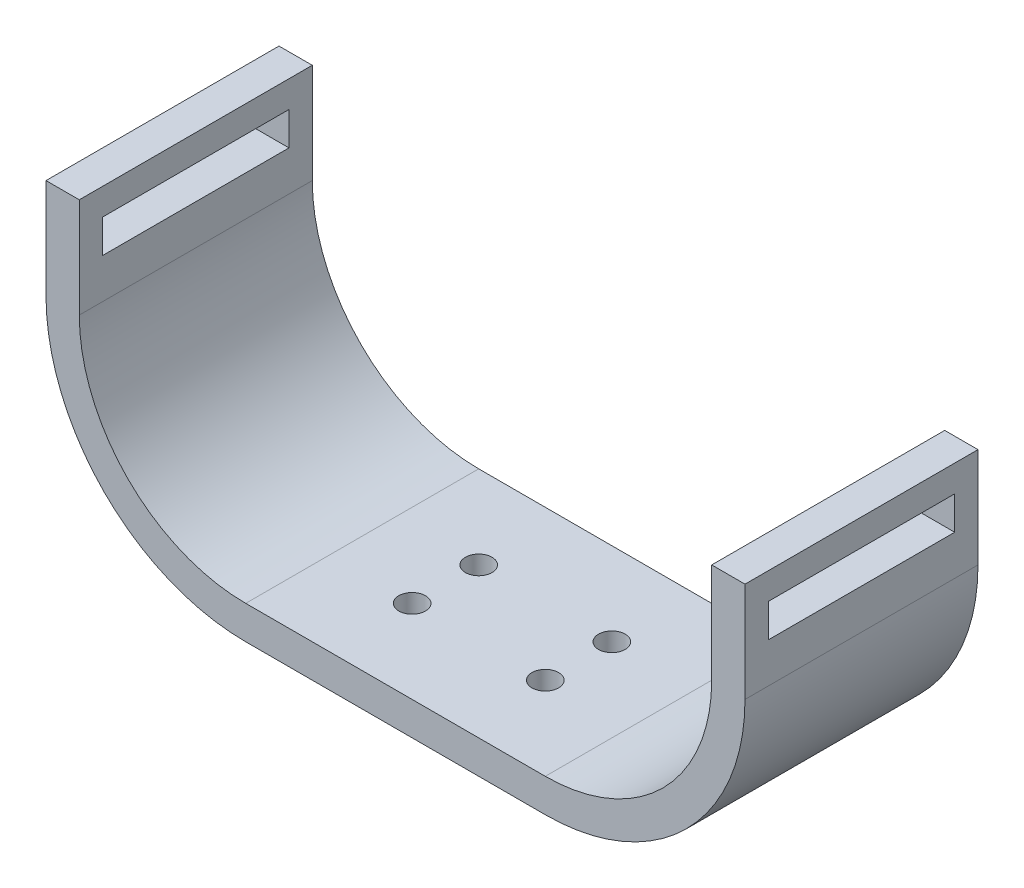
ISO-10303-21;
HEADER;
FILE_DESCRIPTION(('STEP AP214'),'2;1');
FILE_NAME('part.step','',(''),(''),'','','');
FILE_SCHEMA(('AUTOMOTIVE_DESIGN { 1 0 10303 214 1 1 1 1 }'));
ENDSEC;
DATA;
#1=APPLICATION_CONTEXT('core data for automotive mechanical design processes');
#2=APPLICATION_PROTOCOL_DEFINITION('international standard','automotive_design',2000,#1);
#3=PRODUCT_CONTEXT('',#1,'mechanical');
#4=PRODUCT('Part','Part','',(#3));
#5=PRODUCT_RELATED_PRODUCT_CATEGORY('part','',(#4));
#6=PRODUCT_DEFINITION_FORMATION('','',#4);
#7=PRODUCT_DEFINITION_CONTEXT('part definition',#1,'design');
#8=PRODUCT_DEFINITION('design','',#6,#7);
#9=PRODUCT_DEFINITION_SHAPE('','',#8);
#10=(LENGTH_UNIT() NAMED_UNIT(*) SI_UNIT(.MILLI.,.METRE.));
#11=(NAMED_UNIT(*) PLANE_ANGLE_UNIT() SI_UNIT($,.RADIAN.));
#12=(NAMED_UNIT(*) SI_UNIT($,.STERADIAN.) SOLID_ANGLE_UNIT());
#13=UNCERTAINTY_MEASURE_WITH_UNIT(LENGTH_MEASURE(1.E-05),#10,'distance_accuracy_value','');
#14=(GEOMETRIC_REPRESENTATION_CONTEXT(3) GLOBAL_UNCERTAINTY_ASSIGNED_CONTEXT((#13)) GLOBAL_UNIT_ASSIGNED_CONTEXT((#10,
#11,#12)) REPRESENTATION_CONTEXT('',''));
#15=CARTESIAN_POINT('',(0.,0.,0.));
#16=DIRECTION('',(0.,0.,1.));
#17=DIRECTION('',(1.,0.,0.));
#18=AXIS2_PLACEMENT_3D('',#15,#16,#17);
#19=CARTESIAN_POINT('',(22.5000000000001,27.500001563175,35.));
#20=DIRECTION('',(0.,0.,-1.));
#21=DIRECTION('',(-1.,0.,0.));
#22=AXIS2_PLACEMENT_3D('',#19,#20,#21);
#23=CYLINDRICAL_SURFACE('',#22,25.0000034389849);
#24=CARTESIAN_POINT('',(22.5000000000001,27.500001563175,0.));
#25=DIRECTION('',(0.,0.,-1.));
#26=DIRECTION('',(1.,0.,0.));
#27=AXIS2_PLACEMENT_3D('',#24,#25,#26);
#28=CIRCLE('',#27,25.0000034389849);
#29=CARTESIAN_POINT('',(47.5000037516199,27.500001563175,0.));
#30=VERTEX_POINT('',#29);
#31=CARTESIAN_POINT('',(22.5,2.49999843682498,0.));
#32=VERTEX_POINT('',#31);
#33=EDGE_CURVE('E226',#30,#32,#28,.T.);
#34=ORIENTED_EDGE('',*,*,#33,.T.);
#35=DIRECTION('',(0.,0.,-1.));
#36=VECTOR('',#35,1.);
#37=CARTESIAN_POINT('',(22.5,2.49999843682498,35.));
#38=LINE('',#37,#36);
#39=CARTESIAN_POINT('',(22.5,2.49999843682498,35.));
#40=VERTEX_POINT('',#39);
#41=EDGE_CURVE('E309',#40,#32,#38,.T.);
#42=ORIENTED_EDGE('',*,*,#41,.F.);
#43=CARTESIAN_POINT('',(22.5000000000001,27.500001563175,35.));
#44=DIRECTION('',(0.,0.,-1.));
#45=DIRECTION('',(1.,0.,0.));
#46=AXIS2_PLACEMENT_3D('',#43,#44,#45);
#47=CIRCLE('',#46,25.0000034389849);
#48=CARTESIAN_POINT('',(47.5000037516199,27.500001563175,35.));
#49=VERTEX_POINT('',#48);
#50=EDGE_CURVE('E227',#49,#40,#47,.T.);
#51=ORIENTED_EDGE('',*,*,#50,.F.);
#52=DIRECTION('',(0.,0.,-1.));
#53=VECTOR('',#52,1.);
#54=CARTESIAN_POINT('',(47.5000037516199,27.500001563175,35.));
#55=LINE('',#54,#53);
#56=EDGE_CURVE('E253',#49,#30,#55,.T.);
#57=ORIENTED_EDGE('',*,*,#56,.T.);
#58=EDGE_LOOP('',(#34,#42,#51,#57));
#59=FACE_BOUND('',#58,.T.);
#60=ADVANCED_FACE('F33',(#59),#23,.F.);
#61=CARTESIAN_POINT('',(-22.5,2.49999843682497,35.));
#62=DIRECTION('',(0.,-1.,0.));
#63=DIRECTION('',(1.,0.,0.));
#64=AXIS2_PLACEMENT_3D('',#61,#62,#63);
#65=PLANE('',#64);
#66=CARTESIAN_POINT('',(10.,2.49999843682498,12.5));
#67=DIRECTION('',(0.,1.,0.));
#68=DIRECTION('',(1.,0.,0.));
#69=AXIS2_PLACEMENT_3D('',#66,#67,#68);
#70=CIRCLE('',#69,2.);
#71=CARTESIAN_POINT('',(12.,2.49999843682498,12.5));
#72=VERTEX_POINT('',#71);
#73=EDGE_CURVE('E618',#72,#72,#70,.T.);
#74=ORIENTED_EDGE('',*,*,#73,.F.);
#75=EDGE_LOOP('',(#74));
#76=FACE_BOUND('',#75,.T.);
#77=CARTESIAN_POINT('',(10.,2.49999843682498,22.5));
#78=DIRECTION('',(0.,1.,0.));
#79=DIRECTION('',(1.,0.,0.));
#80=AXIS2_PLACEMENT_3D('',#77,#78,#79);
#81=CIRCLE('',#80,2.);
#82=CARTESIAN_POINT('',(12.,2.49999843682498,22.5));
#83=VERTEX_POINT('',#82);
#84=EDGE_CURVE('E620',#83,#83,#81,.T.);
#85=ORIENTED_EDGE('',*,*,#84,.F.);
#86=EDGE_LOOP('',(#85));
#87=FACE_BOUND('',#86,.T.);
#88=CARTESIAN_POINT('',(-10.,2.49999843682498,22.5));
#89=DIRECTION('',(0.,1.,0.));
#90=DIRECTION('',(-1.,0.,0.));
#91=AXIS2_PLACEMENT_3D('',#88,#89,#90);
#92=CIRCLE('',#91,2.);
#93=CARTESIAN_POINT('',(-12.,2.49999843682498,22.5));
#94=VERTEX_POINT('',#93);
#95=EDGE_CURVE('E631',#94,#94,#92,.T.);
#96=ORIENTED_EDGE('',*,*,#95,.F.);
#97=EDGE_LOOP('',(#96));
#98=FACE_BOUND('',#97,.T.);
#99=CARTESIAN_POINT('',(-10.,2.49999843682498,12.5));
#100=DIRECTION('',(0.,1.,0.));
#101=DIRECTION('',(-1.,0.,0.));
#102=AXIS2_PLACEMENT_3D('',#99,#100,#101);
#103=CIRCLE('',#102,2.);
#104=CARTESIAN_POINT('',(-12.,2.49999843682498,12.5));
#105=VERTEX_POINT('',#104);
#106=EDGE_CURVE('E196',#105,#105,#103,.T.);
#107=ORIENTED_EDGE('',*,*,#106,.F.);
#108=EDGE_LOOP('',(#107));
#109=FACE_BOUND('',#108,.T.);
#110=DIRECTION('',(-1.,0.,0.));
#111=VECTOR('',#110,1.);
#112=CARTESIAN_POINT('',(-22.5,2.49999843682497,0.));
#113=LINE('',#112,#111);
#114=CARTESIAN_POINT('',(-22.5,2.49999843682497,0.));
#115=VERTEX_POINT('',#114);
#116=EDGE_CURVE('E256',#32,#115,#113,.T.);
#117=ORIENTED_EDGE('',*,*,#116,.T.);
#118=DIRECTION('',(0.,0.,-1.));
#119=VECTOR('',#118,1.);
#120=CARTESIAN_POINT('',(-22.5,2.49999843682497,35.));
#121=LINE('',#120,#119);
#122=CARTESIAN_POINT('',(-22.5,2.49999843682497,35.));
#123=VERTEX_POINT('',#122);
#124=EDGE_CURVE('E306',#123,#115,#121,.T.);
#125=ORIENTED_EDGE('',*,*,#124,.F.);
#126=DIRECTION('',(-1.,0.,0.));
#127=VECTOR('',#126,1.);
#128=CARTESIAN_POINT('',(-22.5,2.49999843682497,35.));
#129=LINE('',#128,#127);
#130=EDGE_CURVE('E230',#40,#123,#129,.T.);
#131=ORIENTED_EDGE('',*,*,#130,.F.);
#132=ORIENTED_EDGE('',*,*,#41,.T.);
#133=EDGE_LOOP('',(#117,#125,#131,#132));
#134=FACE_BOUND('',#133,.T.);
#135=ADVANCED_FACE('F357',(#76,#87,#98,#109,#134),#65,.F.);
#136=CARTESIAN_POINT('',(-22.5000000000001,27.500001563175,35.));
#137=DIRECTION('',(0.,0.,-1.));
#138=DIRECTION('',(-1.,0.,0.));
#139=AXIS2_PLACEMENT_3D('',#136,#137,#138);
#140=CYLINDRICAL_SURFACE('',#139,25.0000034389849);
#141=CARTESIAN_POINT('',(-22.5000000000001,27.500001563175,0.));
#142=DIRECTION('',(0.,0.,-1.));
#143=DIRECTION('',(-1.,0.,0.));
#144=AXIS2_PLACEMENT_3D('',#141,#142,#143);
#145=CIRCLE('',#144,25.0000034389849);
#146=CARTESIAN_POINT('',(-47.500003438985,27.500001563175,0.));
#147=VERTEX_POINT('',#146);
#148=EDGE_CURVE('E258',#115,#147,#145,.T.);
#149=ORIENTED_EDGE('',*,*,#148,.T.);
#150=DIRECTION('',(0.,0.,-1.));
#151=VECTOR('',#150,1.);
#152=CARTESIAN_POINT('',(-47.500003438985,27.500001563175,35.));
#153=LINE('',#152,#151);
#154=CARTESIAN_POINT('',(-47.500003438985,27.500001563175,35.));
#155=VERTEX_POINT('',#154);
#156=EDGE_CURVE('E303',#155,#147,#153,.T.);
#157=ORIENTED_EDGE('',*,*,#156,.F.);
#158=CARTESIAN_POINT('',(-22.5000000000001,27.500001563175,35.));
#159=DIRECTION('',(0.,0.,-1.));
#160=DIRECTION('',(-1.,0.,0.));
#161=AXIS2_PLACEMENT_3D('',#158,#159,#160);
#162=CIRCLE('',#161,25.0000034389849);
#163=EDGE_CURVE('E233',#123,#155,#162,.T.);
#164=ORIENTED_EDGE('',*,*,#163,.F.);
#165=ORIENTED_EDGE('',*,*,#124,.T.);
#166=EDGE_LOOP('',(#149,#157,#164,#165));
#167=FACE_BOUND('',#166,.T.);
#168=ADVANCED_FACE('F362',(#167),#140,.F.);
#169=CARTESIAN_POINT('',(-47.5000037516199,42.500001563175,35.));
#170=DIRECTION('',(-1.,0.,0.));
#171=DIRECTION('',(0.,-1.,0.));
#172=AXIS2_PLACEMENT_3D('',#169,#170,#171);
#173=PLANE('',#172);
#174=DIRECTION('',(0.,0.,-1.));
#175=VECTOR('',#174,1.);
#176=CARTESIAN_POINT('',(-47.5000037516199,38.500001563175,35.));
#177=LINE('',#176,#175);
#178=CARTESIAN_POINT('',(-47.5000037516199,38.500001563175,31.5));
#179=VERTEX_POINT('',#178);
#180=CARTESIAN_POINT('',(-47.5000037516199,38.500001563175,3.5));
#181=VERTEX_POINT('',#180);
#182=EDGE_CURVE('E211',#179,#181,#177,.T.);
#183=ORIENTED_EDGE('',*,*,#182,.T.);
#184=DIRECTION('',(0.,-1.,0.));
#185=VECTOR('',#184,1.);
#186=CARTESIAN_POINT('',(-47.5000037516199,42.500001563175,3.5));
#187=LINE('',#186,#185);
#188=CARTESIAN_POINT('',(-47.5000037516199,33.500001563175,3.5));
#189=VERTEX_POINT('',#188);
#190=EDGE_CURVE('E175',#181,#189,#187,.T.);
#191=ORIENTED_EDGE('',*,*,#190,.T.);
#192=DIRECTION('',(0.,0.,1.));
#193=VECTOR('',#192,1.);
#194=CARTESIAN_POINT('',(-47.5000037516199,33.500001563175,35.));
#195=LINE('',#194,#193);
#196=CARTESIAN_POINT('',(-47.5000037516199,33.500001563175,31.5));
#197=VERTEX_POINT('',#196);
#198=EDGE_CURVE('E222',#189,#197,#195,.T.);
#199=ORIENTED_EDGE('',*,*,#198,.T.);
#200=DIRECTION('',(0.,1.,0.));
#201=VECTOR('',#200,1.);
#202=CARTESIAN_POINT('',(-47.5000037516199,42.500001563175,31.5));
#203=LINE('',#202,#201);
#204=EDGE_CURVE('E219',#197,#179,#203,.T.);
#205=ORIENTED_EDGE('',*,*,#204,.T.);
#206=EDGE_LOOP('',(#183,#191,#199,#205));
#207=FACE_BOUND('',#206,.T.);
#208=DIRECTION('',(0.,1.,0.));
#209=VECTOR('',#208,1.);
#210=CARTESIAN_POINT('',(-47.5000037516199,42.500001563175,0.));
#211=LINE('',#210,#209);
#212=CARTESIAN_POINT('',(-47.5000037516199,42.500001563175,0.));
#213=VERTEX_POINT('',#212);
#214=EDGE_CURVE('E260',#147,#213,#211,.T.);
#215=ORIENTED_EDGE('',*,*,#214,.T.);
#216=DIRECTION('',(0.,0.,-1.));
#217=VECTOR('',#216,1.);
#218=CARTESIAN_POINT('',(-47.5000037516199,42.500001563175,35.));
#219=LINE('',#218,#217);
#220=CARTESIAN_POINT('',(-47.5000037516199,42.500001563175,35.));
#221=VERTEX_POINT('',#220);
#222=EDGE_CURVE('E300',#221,#213,#219,.T.);
#223=ORIENTED_EDGE('',*,*,#222,.F.);
#224=DIRECTION('',(0.,1.,0.));
#225=VECTOR('',#224,1.);
#226=CARTESIAN_POINT('',(-47.5000037516199,42.500001563175,35.));
#227=LINE('',#226,#225);
#228=EDGE_CURVE('E235',#155,#221,#227,.T.);
#229=ORIENTED_EDGE('',*,*,#228,.F.);
#230=ORIENTED_EDGE('',*,*,#156,.T.);
#231=EDGE_LOOP('',(#215,#223,#229,#230));
#232=FACE_BOUND('',#231,.T.);
#233=ADVANCED_FACE('F409',(#207,#232),#173,.F.);
#234=CARTESIAN_POINT('',(-52.5000037516199,42.500001563175,35.));
#235=DIRECTION('',(0.,-1.,0.));
#236=DIRECTION('',(0.,0.,-1.));
#237=AXIS2_PLACEMENT_3D('',#234,#235,#236);
#238=PLANE('',#237);
#239=DIRECTION('',(-1.,0.,0.));
#240=VECTOR('',#239,1.);
#241=CARTESIAN_POINT('',(-52.5000037516199,42.500001563175,0.));
#242=LINE('',#241,#240);
#243=CARTESIAN_POINT('',(-52.5000037516199,42.500001563175,0.));
#244=VERTEX_POINT('',#243);
#245=EDGE_CURVE('E262',#213,#244,#242,.T.);
#246=ORIENTED_EDGE('',*,*,#245,.T.);
#247=DIRECTION('',(0.,0.,-1.));
#248=VECTOR('',#247,1.);
#249=CARTESIAN_POINT('',(-52.5000037516199,42.500001563175,35.));
#250=LINE('',#249,#248);
#251=CARTESIAN_POINT('',(-52.5000037516199,42.500001563175,35.));
#252=VERTEX_POINT('',#251);
#253=EDGE_CURVE('E297',#252,#244,#250,.T.);
#254=ORIENTED_EDGE('',*,*,#253,.F.);
#255=DIRECTION('',(-1.,0.,0.));
#256=VECTOR('',#255,1.);
#257=CARTESIAN_POINT('',(-52.5000037516199,42.500001563175,35.));
#258=LINE('',#257,#256);
#259=EDGE_CURVE('E237',#221,#252,#258,.T.);
#260=ORIENTED_EDGE('',*,*,#259,.F.);
#261=ORIENTED_EDGE('',*,*,#222,.T.);
#262=EDGE_LOOP('',(#246,#254,#260,#261));
#263=FACE_BOUND('',#262,.T.);
#264=ADVANCED_FACE('F406',(#263),#238,.F.);
#265=CARTESIAN_POINT('',(-52.5000037516199,27.500001563175,35.));
#266=DIRECTION('',(1.,0.,0.));
#267=DIRECTION('',(0.,0.,-1.));
#268=AXIS2_PLACEMENT_3D('',#265,#266,#267);
#269=PLANE('',#268);
#270=DIRECTION('',(0.,0.,-1.));
#271=VECTOR('',#270,1.);
#272=CARTESIAN_POINT('',(-52.5000037516198,33.500001563175,31.5));
#273=LINE('',#272,#271);
#274=CARTESIAN_POINT('',(-52.5000037516198,33.500001563175,31.5));
#275=VERTEX_POINT('',#274);
#276=CARTESIAN_POINT('',(-52.5000037516198,33.500001563175,3.5));
#277=VERTEX_POINT('',#276);
#278=EDGE_CURVE('E189',#275,#277,#273,.T.);
#279=ORIENTED_EDGE('',*,*,#278,.T.);
#280=DIRECTION('',(0.,1.,0.));
#281=VECTOR('',#280,1.);
#282=CARTESIAN_POINT('',(-52.5000037516198,33.500001563175,3.5));
#283=LINE('',#282,#281);
#284=CARTESIAN_POINT('',(-52.5000037516199,38.500001563175,3.5));
#285=VERTEX_POINT('',#284);
#286=EDGE_CURVE('E172',#277,#285,#283,.T.);
#287=ORIENTED_EDGE('',*,*,#286,.T.);
#288=DIRECTION('',(0.,0.,1.));
#289=VECTOR('',#288,1.);
#290=CARTESIAN_POINT('',(-52.5000037516199,38.500001563175,31.5));
#291=LINE('',#290,#289);
#292=CARTESIAN_POINT('',(-52.5000037516199,38.500001563175,31.5));
#293=VERTEX_POINT('',#292);
#294=EDGE_CURVE('E181',#285,#293,#291,.T.);
#295=ORIENTED_EDGE('',*,*,#294,.T.);
#296=DIRECTION('',(0.,-1.,0.));
#297=VECTOR('',#296,1.);
#298=CARTESIAN_POINT('',(-52.5000037516198,33.500001563175,31.5));
#299=LINE('',#298,#297);
#300=EDGE_CURVE('E55',#293,#275,#299,.T.);
#301=ORIENTED_EDGE('',*,*,#300,.T.);
#302=EDGE_LOOP('',(#279,#287,#295,#301));
#303=FACE_BOUND('',#302,.T.);
#304=DIRECTION('',(0.,-1.,0.));
#305=VECTOR('',#304,1.);
#306=CARTESIAN_POINT('',(-52.5000037516199,27.500001563175,0.));
#307=LINE('',#306,#305);
#308=CARTESIAN_POINT('',(-52.5000037516199,27.500001563175,0.));
#309=VERTEX_POINT('',#308);
#310=EDGE_CURVE('E264',#244,#309,#307,.T.);
#311=ORIENTED_EDGE('',*,*,#310,.T.);
#312=DIRECTION('',(0.,0.,-1.));
#313=VECTOR('',#312,1.);
#314=CARTESIAN_POINT('',(-52.5000037516199,27.500001563175,35.));
#315=LINE('',#314,#313);
#316=CARTESIAN_POINT('',(-52.5000037516199,27.500001563175,35.));
#317=VERTEX_POINT('',#316);
#318=EDGE_CURVE('E294',#317,#309,#315,.T.);
#319=ORIENTED_EDGE('',*,*,#318,.F.);
#320=DIRECTION('',(0.,-1.,0.));
#321=VECTOR('',#320,1.);
#322=CARTESIAN_POINT('',(-52.5000037516199,27.500001563175,35.));
#323=LINE('',#322,#321);
#324=EDGE_CURVE('E239',#252,#317,#323,.T.);
#325=ORIENTED_EDGE('',*,*,#324,.F.);
#326=ORIENTED_EDGE('',*,*,#253,.T.);
#327=EDGE_LOOP('',(#311,#319,#325,#326));
#328=FACE_BOUND('',#327,.T.);
#329=ADVANCED_FACE('F186',(#303,#328),#269,.F.);
#330=CARTESIAN_POINT('',(-22.5000000000001,27.500001563175,35.));
#331=DIRECTION('',(0.,0.,-1.));
#332=DIRECTION('',(-1.,0.,0.));
#333=AXIS2_PLACEMENT_3D('',#330,#331,#332);
#334=CYLINDRICAL_SURFACE('',#333,30.0000018758099);
#335=CARTESIAN_POINT('',(-22.5000000000001,27.500001563175,0.));
#336=DIRECTION('',(0.,0.,1.));
#337=DIRECTION('',(-1.,0.,0.));
#338=AXIS2_PLACEMENT_3D('',#335,#336,#337);
#339=CIRCLE('',#338,30.0000018758099);
#340=CARTESIAN_POINT('',(-22.5,-2.50000031263487,0.));
#341=VERTEX_POINT('',#340);
#342=EDGE_CURVE('E266',#309,#341,#339,.T.);
#343=ORIENTED_EDGE('',*,*,#342,.T.);
#344=DIRECTION('',(0.,0.,-1.));
#345=VECTOR('',#344,1.);
#346=CARTESIAN_POINT('',(-22.5,-2.50000031263487,35.));
#347=LINE('',#346,#345);
#348=CARTESIAN_POINT('',(-22.5,-2.50000031263487,35.));
#349=VERTEX_POINT('',#348);
#350=EDGE_CURVE('E291',#349,#341,#347,.T.);
#351=ORIENTED_EDGE('',*,*,#350,.F.);
#352=CARTESIAN_POINT('',(-22.5000000000001,27.500001563175,35.));
#353=DIRECTION('',(0.,0.,1.));
#354=DIRECTION('',(-1.,0.,0.));
#355=AXIS2_PLACEMENT_3D('',#352,#353,#354);
#356=CIRCLE('',#355,30.0000018758099);
#357=EDGE_CURVE('E241',#317,#349,#356,.T.);
#358=ORIENTED_EDGE('',*,*,#357,.F.);
#359=ORIENTED_EDGE('',*,*,#318,.T.);
#360=EDGE_LOOP('',(#343,#351,#358,#359));
#361=FACE_BOUND('',#360,.T.);
#362=ADVANCED_FACE('F399',(#361),#334,.T.);
#363=CARTESIAN_POINT('',(-22.5,-2.49999843682498,35.));
#364=DIRECTION('',(0.,1.,0.));
#365=DIRECTION('',(-1.,0.,0.));
#366=AXIS2_PLACEMENT_3D('',#363,#364,#365);
#367=PLANE('',#366);
#368=CARTESIAN_POINT('',(10.,-2.50000031263488,12.5));
#369=DIRECTION('',(0.,1.,0.));
#370=DIRECTION('',(1.,0.,0.));
#371=AXIS2_PLACEMENT_3D('',#368,#369,#370);
#372=CIRCLE('',#371,2.);
#373=CARTESIAN_POINT('',(12.,-2.50000031263488,12.5));
#374=VERTEX_POINT('',#373);
#375=EDGE_CURVE('E615',#374,#374,#372,.T.);
#376=ORIENTED_EDGE('',*,*,#375,.T.);
#377=EDGE_LOOP('',(#376));
#378=FACE_BOUND('',#377,.T.);
#379=CARTESIAN_POINT('',(10.,-2.50000031263488,22.5));
#380=DIRECTION('',(0.,1.,0.));
#381=DIRECTION('',(1.,0.,0.));
#382=AXIS2_PLACEMENT_3D('',#379,#380,#381);
#383=CIRCLE('',#382,2.);
#384=CARTESIAN_POINT('',(12.,-2.50000031263488,22.5));
#385=VERTEX_POINT('',#384);
#386=EDGE_CURVE('E636',#385,#385,#383,.T.);
#387=ORIENTED_EDGE('',*,*,#386,.T.);
#388=EDGE_LOOP('',(#387));
#389=FACE_BOUND('',#388,.T.);
#390=CARTESIAN_POINT('',(-10.,-2.50000031263488,22.5));
#391=DIRECTION('',(0.,1.,0.));
#392=DIRECTION('',(-1.,0.,0.));
#393=AXIS2_PLACEMENT_3D('',#390,#391,#392);
#394=CIRCLE('',#393,2.);
#395=CARTESIAN_POINT('',(-12.,-2.50000031263488,22.5));
#396=VERTEX_POINT('',#395);
#397=EDGE_CURVE('E627',#396,#396,#394,.T.);
#398=ORIENTED_EDGE('',*,*,#397,.T.);
#399=EDGE_LOOP('',(#398));
#400=FACE_BOUND('',#399,.T.);
#401=CARTESIAN_POINT('',(-10.,-2.50000031263488,12.5));
#402=DIRECTION('',(0.,1.,0.));
#403=DIRECTION('',(-1.,0.,0.));
#404=AXIS2_PLACEMENT_3D('',#401,#402,#403);
#405=CIRCLE('',#404,2.);
#406=CARTESIAN_POINT('',(-12.,-2.50000031263488,12.5));
#407=VERTEX_POINT('',#406);
#408=EDGE_CURVE('E204',#407,#407,#405,.T.);
#409=ORIENTED_EDGE('',*,*,#408,.T.);
#410=EDGE_LOOP('',(#409));
#411=FACE_BOUND('',#410,.T.);
#412=DIRECTION('',(1.,0.,0.));
#413=VECTOR('',#412,1.);
#414=CARTESIAN_POINT('',(-22.5,-2.49999843682498,0.));
#415=LINE('',#414,#413);
#416=CARTESIAN_POINT('',(22.5,-2.49999843682498,0.));
#417=VERTEX_POINT('',#416);
#418=EDGE_CURVE('E268',#341,#417,#415,.T.);
#419=ORIENTED_EDGE('',*,*,#418,.T.);
#420=DIRECTION('',(0.,0.,-1.));
#421=VECTOR('',#420,1.);
#422=CARTESIAN_POINT('',(22.5,-2.49999843682498,35.));
#423=LINE('',#422,#421);
#424=CARTESIAN_POINT('',(22.5,-2.49999843682498,35.));
#425=VERTEX_POINT('',#424);
#426=EDGE_CURVE('E288',#425,#417,#423,.T.);
#427=ORIENTED_EDGE('',*,*,#426,.F.);
#428=DIRECTION('',(1.,0.,0.));
#429=VECTOR('',#428,1.);
#430=CARTESIAN_POINT('',(-22.5,-2.49999843682498,35.));
#431=LINE('',#430,#429);
#432=EDGE_CURVE('E243',#349,#425,#431,.T.);
#433=ORIENTED_EDGE('',*,*,#432,.F.);
#434=ORIENTED_EDGE('',*,*,#350,.T.);
#435=EDGE_LOOP('',(#419,#427,#433,#434));
#436=FACE_BOUND('',#435,.T.);
#437=ADVANCED_FACE('F393',(#378,#389,#400,#411,#436),#367,.F.);
#438=CARTESIAN_POINT('',(22.5000000000001,27.500001563175,35.));
#439=DIRECTION('',(0.,0.,-1.));
#440=DIRECTION('',(-1.,0.,0.));
#441=AXIS2_PLACEMENT_3D('',#438,#439,#440);
#442=CYLINDRICAL_SURFACE('',#441,30.0000018758099);
#443=CARTESIAN_POINT('',(22.5000000000001,27.500001563175,0.));
#444=DIRECTION('',(0.,0.,1.));
#445=DIRECTION('',(1.,0.,0.));
#446=AXIS2_PLACEMENT_3D('',#443,#444,#445);
#447=CIRCLE('',#446,30.0000018758099);
#448=CARTESIAN_POINT('',(52.50000187581,27.500001563175,0.));
#449=VERTEX_POINT('',#448);
#450=EDGE_CURVE('E270',#417,#449,#447,.T.);
#451=ORIENTED_EDGE('',*,*,#450,.T.);
#452=DIRECTION('',(0.,0.,-1.));
#453=VECTOR('',#452,1.);
#454=CARTESIAN_POINT('',(52.50000187581,27.500001563175,35.));
#455=LINE('',#454,#453);
#456=CARTESIAN_POINT('',(52.50000187581,27.500001563175,35.));
#457=VERTEX_POINT('',#456);
#458=EDGE_CURVE('E285',#457,#449,#455,.T.);
#459=ORIENTED_EDGE('',*,*,#458,.F.);
#460=CARTESIAN_POINT('',(22.5000000000001,27.500001563175,35.));
#461=DIRECTION('',(0.,0.,1.));
#462=DIRECTION('',(1.,0.,0.));
#463=AXIS2_PLACEMENT_3D('',#460,#461,#462);
#464=CIRCLE('',#463,30.0000018758099);
#465=EDGE_CURVE('E245',#425,#457,#464,.T.);
#466=ORIENTED_EDGE('',*,*,#465,.F.);
#467=ORIENTED_EDGE('',*,*,#426,.T.);
#468=EDGE_LOOP('',(#451,#459,#466,#467));
#469=FACE_BOUND('',#468,.T.);
#470=ADVANCED_FACE('F389',(#469),#442,.T.);
#471=CARTESIAN_POINT('',(52.5000037516199,27.500001563175,35.));
#472=DIRECTION('',(-1.,0.,0.));
#473=DIRECTION('',(0.,-1.,0.));
#474=AXIS2_PLACEMENT_3D('',#471,#472,#473);
#475=PLANE('',#474);
#476=DIRECTION('',(0.,0.,1.));
#477=VECTOR('',#476,1.);
#478=CARTESIAN_POINT('',(52.5000037516198,38.500001563175,31.5));
#479=LINE('',#478,#477);
#480=CARTESIAN_POINT('',(52.5000037516198,38.500001563175,3.5));
#481=VERTEX_POINT('',#480);
#482=CARTESIAN_POINT('',(52.5000037516198,38.500001563175,31.5));
#483=VERTEX_POINT('',#482);
#484=EDGE_CURVE('E203',#481,#483,#479,.T.);
#485=ORIENTED_EDGE('',*,*,#484,.F.);
#486=DIRECTION('',(0.,1.,0.));
#487=VECTOR('',#486,1.);
#488=CARTESIAN_POINT('',(52.5000037516198,33.500001563175,3.5));
#489=LINE('',#488,#487);
#490=CARTESIAN_POINT('',(52.5000037516198,33.500001563175,3.5));
#491=VERTEX_POINT('',#490);
#492=EDGE_CURVE('E201',#491,#481,#489,.T.);
#493=ORIENTED_EDGE('',*,*,#492,.F.);
#494=DIRECTION('',(0.,0.,-1.));
#495=VECTOR('',#494,1.);
#496=CARTESIAN_POINT('',(52.5000037516198,33.500001563175,31.5));
#497=LINE('',#496,#495);
#498=CARTESIAN_POINT('',(52.5000037516198,33.500001563175,31.5));
#499=VERTEX_POINT('',#498);
#500=EDGE_CURVE('E190',#499,#491,#497,.T.);
#501=ORIENTED_EDGE('',*,*,#500,.F.);
#502=DIRECTION('',(0.,-1.,0.));
#503=VECTOR('',#502,1.);
#504=CARTESIAN_POINT('',(52.5000037516198,33.500001563175,31.5));
#505=LINE('',#504,#503);
#506=EDGE_CURVE('E193',#483,#499,#505,.T.);
#507=ORIENTED_EDGE('',*,*,#506,.F.);
#508=EDGE_LOOP('',(#485,#493,#501,#507));
#509=FACE_BOUND('',#508,.T.);
#510=DIRECTION('',(0.,1.,0.));
#511=VECTOR('',#510,1.);
#512=CARTESIAN_POINT('',(52.5000037516199,27.500001563175,0.));
#513=LINE('',#512,#511);
#514=CARTESIAN_POINT('',(52.5000037516198,42.500001563175,0.));
#515=VERTEX_POINT('',#514);
#516=EDGE_CURVE('E272',#449,#515,#513,.T.);
#517=ORIENTED_EDGE('',*,*,#516,.T.);
#518=DIRECTION('',(0.,0.,-1.));
#519=VECTOR('',#518,1.);
#520=CARTESIAN_POINT('',(52.5000037516198,42.500001563175,35.));
#521=LINE('',#520,#519);
#522=CARTESIAN_POINT('',(52.5000037516198,42.500001563175,35.));
#523=VERTEX_POINT('',#522);
#524=EDGE_CURVE('E282',#523,#515,#521,.T.);
#525=ORIENTED_EDGE('',*,*,#524,.F.);
#526=DIRECTION('',(0.,1.,0.));
#527=VECTOR('',#526,1.);
#528=CARTESIAN_POINT('',(52.5000037516199,27.500001563175,35.));
#529=LINE('',#528,#527);
#530=EDGE_CURVE('E247',#457,#523,#529,.T.);
#531=ORIENTED_EDGE('',*,*,#530,.F.);
#532=ORIENTED_EDGE('',*,*,#458,.T.);
#533=EDGE_LOOP('',(#517,#525,#531,#532));
#534=FACE_BOUND('',#533,.T.);
#535=ADVANCED_FACE('F333',(#509,#534),#475,.F.);
#536=CARTESIAN_POINT('',(52.5000037516198,42.500001563175,35.));
#537=DIRECTION('',(0.,-1.,0.));
#538=DIRECTION('',(0.,0.,-1.));
#539=AXIS2_PLACEMENT_3D('',#536,#537,#538);
#540=PLANE('',#539);
#541=DIRECTION('',(-1.,0.,0.));
#542=VECTOR('',#541,1.);
#543=CARTESIAN_POINT('',(52.5000037516198,42.500001563175,0.));
#544=LINE('',#543,#542);
#545=CARTESIAN_POINT('',(47.5000037516198,42.500001563175,0.));
#546=VERTEX_POINT('',#545);
#547=EDGE_CURVE('E274',#515,#546,#544,.T.);
#548=ORIENTED_EDGE('',*,*,#547,.T.);
#549=DIRECTION('',(0.,0.,-1.));
#550=VECTOR('',#549,1.);
#551=CARTESIAN_POINT('',(47.5000037516198,42.500001563175,35.));
#552=LINE('',#551,#550);
#553=CARTESIAN_POINT('',(47.5000037516198,42.500001563175,35.));
#554=VERTEX_POINT('',#553);
#555=EDGE_CURVE('E279',#554,#546,#552,.T.);
#556=ORIENTED_EDGE('',*,*,#555,.F.);
#557=DIRECTION('',(-1.,0.,0.));
#558=VECTOR('',#557,1.);
#559=CARTESIAN_POINT('',(52.5000037516198,42.500001563175,35.));
#560=LINE('',#559,#558);
#561=EDGE_CURVE('E249',#523,#554,#560,.T.);
#562=ORIENTED_EDGE('',*,*,#561,.F.);
#563=ORIENTED_EDGE('',*,*,#524,.T.);
#564=EDGE_LOOP('',(#548,#556,#562,#563));
#565=FACE_BOUND('',#564,.T.);
#566=ADVANCED_FACE('F380',(#565),#540,.F.);
#567=CARTESIAN_POINT('',(47.5000037516198,42.500001563175,35.));
#568=DIRECTION('',(1.,0.,0.));
#569=DIRECTION('',(0.,1.,0.));
#570=AXIS2_PLACEMENT_3D('',#567,#568,#569);
#571=PLANE('',#570);
#572=DIRECTION('',(0.,0.,-1.));
#573=VECTOR('',#572,1.);
#574=CARTESIAN_POINT('',(47.5000037516199,33.500001563175,35.));
#575=LINE('',#574,#573);
#576=CARTESIAN_POINT('',(47.5000037516199,33.500001563175,31.5));
#577=VERTEX_POINT('',#576);
#578=CARTESIAN_POINT('',(47.5000037516199,33.500001563175,3.5));
#579=VERTEX_POINT('',#578);
#580=EDGE_CURVE('E40',#577,#579,#575,.T.);
#581=ORIENTED_EDGE('',*,*,#580,.T.);
#582=DIRECTION('',(0.,1.,0.));
#583=VECTOR('',#582,1.);
#584=CARTESIAN_POINT('',(47.5000037516198,42.500001563175,3.5));
#585=LINE('',#584,#583);
#586=CARTESIAN_POINT('',(47.5000037516199,38.500001563175,3.5));
#587=VERTEX_POINT('',#586);
#588=EDGE_CURVE('E11',#579,#587,#585,.T.);
#589=ORIENTED_EDGE('',*,*,#588,.T.);
#590=DIRECTION('',(0.,0.,1.));
#591=VECTOR('',#590,1.);
#592=CARTESIAN_POINT('',(47.5000037516198,38.500001563175,35.));
#593=LINE('',#592,#591);
#594=CARTESIAN_POINT('',(47.5000037516198,38.500001563175,31.5));
#595=VERTEX_POINT('',#594);
#596=EDGE_CURVE('E312',#587,#595,#593,.T.);
#597=ORIENTED_EDGE('',*,*,#596,.T.);
#598=DIRECTION('',(0.,-1.,0.));
#599=VECTOR('',#598,1.);
#600=CARTESIAN_POINT('',(47.5000037516198,42.500001563175,31.5));
#601=LINE('',#600,#599);
#602=EDGE_CURVE('E315',#595,#577,#601,.T.);
#603=ORIENTED_EDGE('',*,*,#602,.T.);
#604=EDGE_LOOP('',(#581,#589,#597,#603));
#605=FACE_BOUND('',#604,.T.);
#606=DIRECTION('',(0.,-1.,0.));
#607=VECTOR('',#606,1.);
#608=CARTESIAN_POINT('',(47.5000037516198,42.500001563175,0.));
#609=LINE('',#608,#607);
#610=EDGE_CURVE('E231',#546,#30,#609,.T.);
#611=ORIENTED_EDGE('',*,*,#610,.T.);
#612=ORIENTED_EDGE('',*,*,#56,.F.);
#613=DIRECTION('',(0.,-1.,0.));
#614=VECTOR('',#613,1.);
#615=CARTESIAN_POINT('',(47.5000037516198,42.500001563175,35.));
#616=LINE('',#615,#614);
#617=EDGE_CURVE('E251',#554,#49,#616,.T.);
#618=ORIENTED_EDGE('',*,*,#617,.F.);
#619=ORIENTED_EDGE('',*,*,#555,.T.);
#620=EDGE_LOOP('',(#611,#612,#618,#619));
#621=FACE_BOUND('',#620,.T.);
#622=ADVANCED_FACE('F319',(#605,#621),#571,.F.);
#623=CARTESIAN_POINT('',(22.5000000000001,27.500001563175,35.));
#624=DIRECTION('',(0.,0.,1.));
#625=DIRECTION('',(1.,0.,0.));
#626=AXIS2_PLACEMENT_3D('',#623,#624,#625);
#627=PLANE('',#626);
#628=ORIENTED_EDGE('',*,*,#50,.T.);
#629=ORIENTED_EDGE('',*,*,#130,.T.);
#630=ORIENTED_EDGE('',*,*,#163,.T.);
#631=ORIENTED_EDGE('',*,*,#228,.T.);
#632=ORIENTED_EDGE('',*,*,#259,.T.);
#633=ORIENTED_EDGE('',*,*,#324,.T.);
#634=ORIENTED_EDGE('',*,*,#357,.T.);
#635=ORIENTED_EDGE('',*,*,#432,.T.);
#636=ORIENTED_EDGE('',*,*,#465,.T.);
#637=ORIENTED_EDGE('',*,*,#530,.T.);
#638=ORIENTED_EDGE('',*,*,#561,.T.);
#639=ORIENTED_EDGE('',*,*,#617,.T.);
#640=EDGE_LOOP('',(#628,#629,#630,#631,#632,#633,#634,#635,#636,#637,#638,#639));
#641=FACE_BOUND('',#640,.T.);
#642=ADVANCED_FACE('F350',(#641),#627,.T.);
#643=CARTESIAN_POINT('',(22.5000000000001,27.500001563175,0.));
#644=DIRECTION('',(0.,0.,1.));
#645=DIRECTION('',(1.,0.,0.));
#646=AXIS2_PLACEMENT_3D('',#643,#644,#645);
#647=PLANE('',#646);
#648=ORIENTED_EDGE('',*,*,#33,.F.);
#649=ORIENTED_EDGE('',*,*,#610,.F.);
#650=ORIENTED_EDGE('',*,*,#547,.F.);
#651=ORIENTED_EDGE('',*,*,#516,.F.);
#652=ORIENTED_EDGE('',*,*,#450,.F.);
#653=ORIENTED_EDGE('',*,*,#418,.F.);
#654=ORIENTED_EDGE('',*,*,#342,.F.);
#655=ORIENTED_EDGE('',*,*,#310,.F.);
#656=ORIENTED_EDGE('',*,*,#245,.F.);
#657=ORIENTED_EDGE('',*,*,#214,.F.);
#658=ORIENTED_EDGE('',*,*,#148,.F.);
#659=ORIENTED_EDGE('',*,*,#116,.F.);
#660=EDGE_LOOP('',(#648,#649,#650,#651,#652,#653,#654,#655,#656,#657,#658,#659));
#661=FACE_BOUND('',#660,.T.);
#662=ADVANCED_FACE('F342',(#661),#647,.F.);
#663=CARTESIAN_POINT('',(-52.5000037516199,38.500001563175,31.5));
#664=DIRECTION('',(0.,1.,0.));
#665=DIRECTION('',(0.,0.,1.));
#666=AXIS2_PLACEMENT_3D('',#663,#664,#665);
#667=PLANE('',#666);
#668=DIRECTION('',(1.,0.,0.));
#669=VECTOR('',#668,1.);
#670=CARTESIAN_POINT('',(-52.5000037516199,38.500001563175,3.5));
#671=LINE('',#670,#669);
#672=EDGE_CURVE('E178',#587,#481,#671,.T.);
#673=ORIENTED_EDGE('',*,*,#672,.T.);
#674=ORIENTED_EDGE('',*,*,#484,.T.);
#675=DIRECTION('',(1.,0.,0.));
#676=VECTOR('',#675,1.);
#677=CARTESIAN_POINT('',(-52.5000037516199,38.500001563175,31.5));
#678=LINE('',#677,#676);
#679=EDGE_CURVE('E177',#595,#483,#678,.T.);
#680=ORIENTED_EDGE('',*,*,#679,.F.);
#681=ORIENTED_EDGE('',*,*,#596,.F.);
#682=EDGE_LOOP('',(#673,#674,#680,#681));
#683=FACE_BOUND('',#682,.T.);
#684=ADVANCED_FACE('F340',(#683),#667,.F.);
#685=CARTESIAN_POINT('',(-52.5000037516198,33.500001563175,31.5));
#686=DIRECTION('',(0.,0.,1.));
#687=DIRECTION('',(1.,0.,0.));
#688=AXIS2_PLACEMENT_3D('',#685,#686,#687);
#689=PLANE('',#688);
#690=ORIENTED_EDGE('',*,*,#679,.T.);
#691=ORIENTED_EDGE('',*,*,#506,.T.);
#692=DIRECTION('',(1.,0.,0.));
#693=VECTOR('',#692,1.);
#694=CARTESIAN_POINT('',(-52.5000037516198,33.500001563175,31.5));
#695=LINE('',#694,#693);
#696=EDGE_CURVE('E216',#577,#499,#695,.T.);
#697=ORIENTED_EDGE('',*,*,#696,.F.);
#698=ORIENTED_EDGE('',*,*,#602,.F.);
#699=EDGE_LOOP('',(#690,#691,#697,#698));
#700=FACE_BOUND('',#699,.T.);
#701=ADVANCED_FACE('F327',(#700),#689,.F.);
#702=CARTESIAN_POINT('',(-52.5000037516198,33.500001563175,31.5));
#703=DIRECTION('',(0.,-1.,0.));
#704=DIRECTION('',(0.,0.,-1.));
#705=AXIS2_PLACEMENT_3D('',#702,#703,#704);
#706=PLANE('',#705);
#707=ORIENTED_EDGE('',*,*,#696,.T.);
#708=ORIENTED_EDGE('',*,*,#500,.T.);
#709=DIRECTION('',(1.,0.,0.));
#710=VECTOR('',#709,1.);
#711=CARTESIAN_POINT('',(-52.5000037516198,33.500001563175,3.5));
#712=LINE('',#711,#710);
#713=EDGE_CURVE('E212',#579,#491,#712,.T.);
#714=ORIENTED_EDGE('',*,*,#713,.F.);
#715=ORIENTED_EDGE('',*,*,#580,.F.);
#716=EDGE_LOOP('',(#707,#708,#714,#715));
#717=FACE_BOUND('',#716,.T.);
#718=ADVANCED_FACE('F325',(#717),#706,.F.);
#719=CARTESIAN_POINT('',(-52.5000037516198,33.500001563175,3.5));
#720=DIRECTION('',(0.,0.,-1.));
#721=DIRECTION('',(0.,1.,0.));
#722=AXIS2_PLACEMENT_3D('',#719,#720,#721);
#723=PLANE('',#722);
#724=ORIENTED_EDGE('',*,*,#713,.T.);
#725=ORIENTED_EDGE('',*,*,#492,.T.);
#726=ORIENTED_EDGE('',*,*,#672,.F.);
#727=ORIENTED_EDGE('',*,*,#588,.F.);
#728=EDGE_LOOP('',(#724,#725,#726,#727));
#729=FACE_BOUND('',#728,.T.);
#730=ADVANCED_FACE('F338',(#729),#723,.F.);
#731=EDGE_CURVE('E47',#285,#181,#671,.T.);
#732=ORIENTED_EDGE('',*,*,#731,.F.);
#733=ORIENTED_EDGE('',*,*,#286,.F.);
#734=EDGE_CURVE('E209',#277,#189,#712,.T.);
#735=ORIENTED_EDGE('',*,*,#734,.T.);
#736=ORIENTED_EDGE('',*,*,#190,.F.);
#737=EDGE_LOOP('',(#732,#733,#735,#736));
#738=FACE_BOUND('',#737,.T.);
#739=ADVANCED_FACE('F169',(#738),#723,.F.);
#740=ORIENTED_EDGE('',*,*,#734,.F.);
#741=ORIENTED_EDGE('',*,*,#278,.F.);
#742=EDGE_CURVE('E213',#275,#197,#695,.T.);
#743=ORIENTED_EDGE('',*,*,#742,.T.);
#744=ORIENTED_EDGE('',*,*,#198,.F.);
#745=EDGE_LOOP('',(#740,#741,#743,#744));
#746=FACE_BOUND('',#745,.T.);
#747=ADVANCED_FACE('F440',(#746),#706,.F.);
#748=ORIENTED_EDGE('',*,*,#742,.F.);
#749=ORIENTED_EDGE('',*,*,#300,.F.);
#750=EDGE_CURVE('E183',#293,#179,#678,.T.);
#751=ORIENTED_EDGE('',*,*,#750,.T.);
#752=ORIENTED_EDGE('',*,*,#204,.F.);
#753=EDGE_LOOP('',(#748,#749,#751,#752));
#754=FACE_BOUND('',#753,.T.);
#755=ADVANCED_FACE('F349',(#754),#689,.F.);
#756=ORIENTED_EDGE('',*,*,#750,.F.);
#757=ORIENTED_EDGE('',*,*,#294,.F.);
#758=ORIENTED_EDGE('',*,*,#731,.T.);
#759=ORIENTED_EDGE('',*,*,#182,.F.);
#760=EDGE_LOOP('',(#756,#757,#758,#759));
#761=FACE_BOUND('',#760,.T.);
#762=ADVANCED_FACE('F182',(#761),#667,.F.);
#763=CARTESIAN_POINT('',(-10.,-2.50000031263488,12.5));
#764=DIRECTION('',(0.,1.,0.));
#765=DIRECTION('',(-1.,0.,0.));
#766=AXIS2_PLACEMENT_3D('',#763,#764,#765);
#767=CYLINDRICAL_SURFACE('',#766,2.);
#768=ORIENTED_EDGE('',*,*,#408,.F.);
#769=EDGE_LOOP('',(#768));
#770=FACE_BOUND('',#769,.T.);
#771=ORIENTED_EDGE('',*,*,#106,.T.);
#772=EDGE_LOOP('',(#771));
#773=FACE_BOUND('',#772,.T.);
#774=ADVANCED_FACE('F355',(#770,#773),#767,.F.);
#775=CARTESIAN_POINT('',(-10.,-2.50000031263488,22.5));
#776=DIRECTION('',(0.,1.,0.));
#777=DIRECTION('',(-1.,0.,0.));
#778=AXIS2_PLACEMENT_3D('',#775,#776,#777);
#779=CYLINDRICAL_SURFACE('',#778,2.);
#780=ORIENTED_EDGE('',*,*,#397,.F.);
#781=EDGE_LOOP('',(#780));
#782=FACE_BOUND('',#781,.T.);
#783=ORIENTED_EDGE('',*,*,#95,.T.);
#784=EDGE_LOOP('',(#783));
#785=FACE_BOUND('',#784,.T.);
#786=ADVANCED_FACE('F470',(#782,#785),#779,.F.);
#787=CARTESIAN_POINT('',(10.,-2.50000031263488,22.5));
#788=DIRECTION('',(0.,1.,0.));
#789=DIRECTION('',(-1.,0.,0.));
#790=AXIS2_PLACEMENT_3D('',#787,#788,#789);
#791=CYLINDRICAL_SURFACE('',#790,2.);
#792=ORIENTED_EDGE('',*,*,#386,.F.);
#793=EDGE_LOOP('',(#792));
#794=FACE_BOUND('',#793,.T.);
#795=ORIENTED_EDGE('',*,*,#84,.T.);
#796=EDGE_LOOP('',(#795));
#797=FACE_BOUND('',#796,.T.);
#798=ADVANCED_FACE('F478',(#794,#797),#791,.F.);
#799=CARTESIAN_POINT('',(10.,-2.50000031263488,12.5));
#800=DIRECTION('',(0.,1.,0.));
#801=DIRECTION('',(-1.,0.,0.));
#802=AXIS2_PLACEMENT_3D('',#799,#800,#801);
#803=CYLINDRICAL_SURFACE('',#802,2.);
#804=ORIENTED_EDGE('',*,*,#375,.F.);
#805=EDGE_LOOP('',(#804));
#806=FACE_BOUND('',#805,.T.);
#807=ORIENTED_EDGE('',*,*,#73,.T.);
#808=EDGE_LOOP('',(#807));
#809=FACE_BOUND('',#808,.T.);
#810=ADVANCED_FACE('F486',(#806,#809),#803,.F.);
#811=CLOSED_SHELL('',(#60,#135,#168,#233,#264,#329,#362,#437,#470,#535,#566,#622,#642,#662,#684,
#701,#718,#730,#739,#747,#755,#762,#774,#786,#798,#810));
#812=MANIFOLD_SOLID_BREP('B2',#811);
#813=ADVANCED_BREP_SHAPE_REPRESENTATION('',(#18,#812),#14);
#814=SHAPE_DEFINITION_REPRESENTATION(#9,#813);
ENDSEC;
END-ISO-10303-21;
